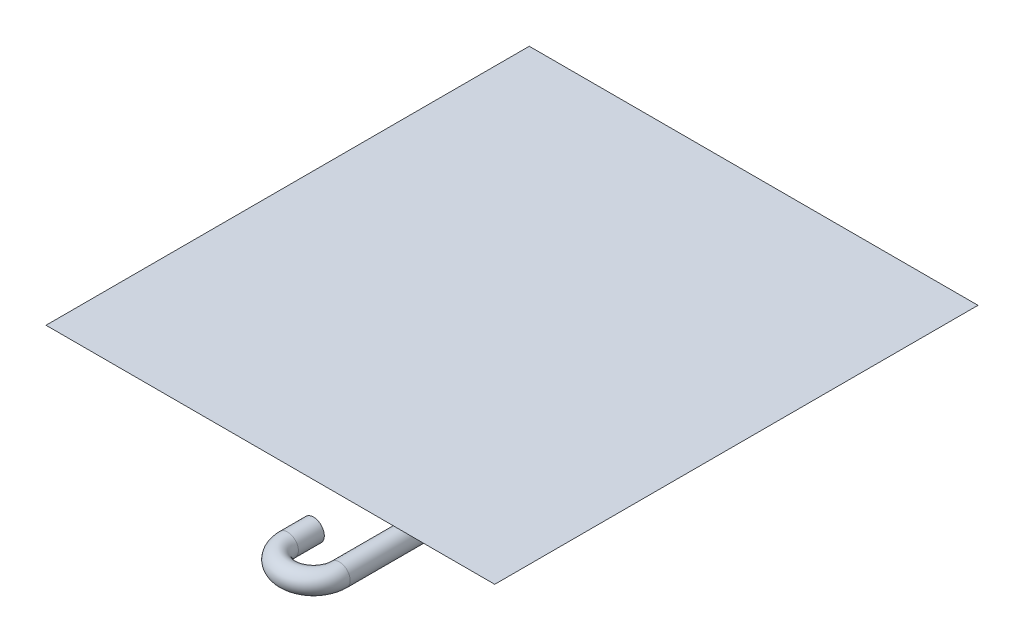
ISO-10303-21;
HEADER;
FILE_DESCRIPTION(('STEP AP214'),'2;1');
FILE_NAME('part.step','',(''),(''),'','','');
FILE_SCHEMA(('AUTOMOTIVE_DESIGN { 1 0 10303 214 1 1 1 1 }'));
ENDSEC;
DATA;
#1=APPLICATION_CONTEXT('core data for automotive mechanical design processes');
#2=APPLICATION_PROTOCOL_DEFINITION('international standard','automotive_design',2000,#1);
#3=PRODUCT_CONTEXT('',#1,'mechanical');
#4=PRODUCT('Part','Part','',(#3));
#5=PRODUCT_RELATED_PRODUCT_CATEGORY('part','',(#4));
#6=PRODUCT_DEFINITION_FORMATION('','',#4);
#7=PRODUCT_DEFINITION_CONTEXT('part definition',#1,'design');
#8=PRODUCT_DEFINITION('design','',#6,#7);
#9=PRODUCT_DEFINITION_SHAPE('','',#8);
#10=(LENGTH_UNIT() NAMED_UNIT(*) SI_UNIT(.MILLI.,.METRE.));
#11=(NAMED_UNIT(*) PLANE_ANGLE_UNIT() SI_UNIT($,.RADIAN.));
#12=(NAMED_UNIT(*) SI_UNIT($,.STERADIAN.) SOLID_ANGLE_UNIT());
#13=UNCERTAINTY_MEASURE_WITH_UNIT(LENGTH_MEASURE(1.E-05),#10,'distance_accuracy_value','');
#14=(GEOMETRIC_REPRESENTATION_CONTEXT(3) GLOBAL_UNCERTAINTY_ASSIGNED_CONTEXT((#13)) GLOBAL_UNIT_ASSIGNED_CONTEXT((#10,
#11,#12)) REPRESENTATION_CONTEXT('',''));
#15=CARTESIAN_POINT('',(0.,0.,0.));
#16=DIRECTION('',(0.,0.,1.));
#17=DIRECTION('',(1.,0.,0.));
#18=AXIS2_PLACEMENT_3D('',#15,#16,#17);
#19=CARTESIAN_POINT('',(0.,-50.8,63.5));
#20=DIRECTION('',(0.,0.,-1.));
#21=DIRECTION('',(-1.,0.,0.));
#22=AXIS2_PLACEMENT_3D('',#19,#20,#21);
#23=CYLINDRICAL_SURFACE('',#22,3.96875);
#24=CARTESIAN_POINT('',(0.,-50.8,63.5));
#25=DIRECTION('',(0.,0.,1.));
#26=DIRECTION('',(1.,0.,0.));
#27=AXIS2_PLACEMENT_3D('',#24,#25,#26);
#28=CIRCLE('',#27,3.96875);
#29=CARTESIAN_POINT('',(3.96875,-50.8,63.5));
#30=VERTEX_POINT('',#29);
#31=EDGE_CURVE('E11',#30,#30,#28,.T.);
#32=ORIENTED_EDGE('',*,*,#31,.F.);
#33=EDGE_LOOP('',(#32));
#34=FACE_BOUND('',#33,.T.);
#35=CARTESIAN_POINT('',(0.,-50.8,-63.5));
#36=DIRECTION('',(0.,0.,1.));
#37=DIRECTION('',(1.,0.,0.));
#38=AXIS2_PLACEMENT_3D('',#35,#36,#37);
#39=CIRCLE('',#38,3.96875);
#40=CARTESIAN_POINT('',(3.96875,-50.8,-63.5));
#41=VERTEX_POINT('',#40);
#42=EDGE_CURVE('E51',#41,#41,#39,.T.);
#43=ORIENTED_EDGE('',*,*,#42,.T.);
#44=EDGE_LOOP('',(#43));
#45=FACE_BOUND('',#44,.T.);
#46=ADVANCED_FACE('F45',(#34,#45),#23,.T.);
#47=CARTESIAN_POINT('',(0.,-50.8,-63.5));
#48=DIRECTION('',(0.,0.,1.));
#49=DIRECTION('',(1.,0.,0.));
#50=AXIS2_PLACEMENT_3D('',#47,#48,#49);
#51=PLANE('',#50);
#52=ORIENTED_EDGE('',*,*,#42,.F.);
#53=EDGE_LOOP('',(#52));
#54=FACE_BOUND('',#53,.T.);
#55=ADVANCED_FACE('F78',(#54),#51,.F.);
#56=CARTESIAN_POINT('',(-19.05,-50.8,63.5));
#57=DIRECTION('',(0.,0.,-1.));
#58=DIRECTION('',(-1.,0.,0.));
#59=AXIS2_PLACEMENT_3D('',#56,#57,#58);
#60=CYLINDRICAL_SURFACE('',#59,3.96875);
#61=CARTESIAN_POINT('',(-19.05,-50.8,63.5));
#62=DIRECTION('',(0.,0.,-1.));
#63=DIRECTION('',(-1.,0.,0.));
#64=AXIS2_PLACEMENT_3D('',#61,#62,#63);
#65=CIRCLE('',#64,3.96875);
#66=CARTESIAN_POINT('',(-23.01875,-50.8,63.5));
#67=VERTEX_POINT('',#66);
#68=EDGE_CURVE('E59',#67,#67,#65,.T.);
#69=ORIENTED_EDGE('',*,*,#68,.T.);
#70=EDGE_LOOP('',(#69));
#71=FACE_BOUND('',#70,.T.);
#72=CARTESIAN_POINT('',(-19.05,-50.8,53.975));
#73=DIRECTION('',(0.,0.,-1.));
#74=DIRECTION('',(-1.,0.,0.));
#75=AXIS2_PLACEMENT_3D('',#72,#73,#74);
#76=CIRCLE('',#75,3.96875);
#77=CARTESIAN_POINT('',(-23.01875,-50.8,53.975));
#78=VERTEX_POINT('',#77);
#79=EDGE_CURVE('E55',#78,#78,#76,.T.);
#80=ORIENTED_EDGE('',*,*,#79,.F.);
#81=EDGE_LOOP('',(#80));
#82=FACE_BOUND('',#81,.T.);
#83=ADVANCED_FACE('F65',(#71,#82),#60,.T.);
#84=CARTESIAN_POINT('',(-9.525,-50.8,63.5));
#85=DIRECTION('',(0.,1.,0.));
#86=DIRECTION('',(0.,0.,1.));
#87=AXIS2_PLACEMENT_3D('',#84,#85,#86);
#88=TOROIDAL_SURFACE('',#87,9.525,3.96875);
#89=CARTESIAN_POINT('',(-9.525,-50.8,63.5));
#90=DIRECTION('',(0.,1.,0.));
#91=DIRECTION('',(0.,0.,1.));
#92=AXIS2_PLACEMENT_3D('',#89,#90,#91);
#93=CIRCLE('',#92,13.49375);
#94=EDGE_CURVE('',#67,#30,#93,.T.);
#95=ORIENTED_EDGE('',*,*,#68,.F.);
#96=ORIENTED_EDGE('',*,*,#31,.T.);
#97=ORIENTED_EDGE('',*,*,#94,.T.);
#98=ORIENTED_EDGE('',*,*,#94,.F.);
#99=EDGE_LOOP('',(#95,#97,#96,#98));
#100=FACE_BOUND('',#99,.T.);
#101=ADVANCED_FACE('F68',(#100),#88,.T.);
#102=CARTESIAN_POINT('',(-19.05,-50.8,53.975));
#103=DIRECTION('',(0.,0.,-1.));
#104=DIRECTION('',(-1.,0.,0.));
#105=AXIS2_PLACEMENT_3D('',#102,#103,#104);
#106=PLANE('',#105);
#107=ORIENTED_EDGE('',*,*,#79,.T.);
#108=EDGE_LOOP('',(#107));
#109=FACE_BOUND('',#108,.T.);
#110=ADVANCED_FACE('F70',(#109),#106,.T.);
#111=CLOSED_SHELL('',(#46,#55,#83,#101,#110));
#112=MANIFOLD_SOLID_BREP('B2',#111);
#113=CARTESIAN_POINT('',(-82.55,0.,-88.9));
#114=DIRECTION('',(0.,-1.,0.));
#115=DIRECTION('',(0.,0.,-1.));
#116=AXIS2_PLACEMENT_3D('',#113,#114,#115);
#117=PLANE('',#116);
#118=DIRECTION('',(1.,0.,0.));
#119=VECTOR('',#118,1.);
#120=CARTESIAN_POINT('',(-82.55,0.,88.9));
#121=LINE('',#120,#119);
#122=CARTESIAN_POINT('',(-82.55,0.,88.9));
#123=VERTEX_POINT('',#122);
#124=CARTESIAN_POINT('',(82.55,0.,88.9));
#125=VERTEX_POINT('',#124);
#126=EDGE_CURVE('E134',#123,#125,#121,.T.);
#127=ORIENTED_EDGE('',*,*,#126,.F.);
#128=DIRECTION('',(0.,0.,1.));
#129=VECTOR('',#128,1.);
#130=CARTESIAN_POINT('',(-82.55,0.,-88.9));
#131=LINE('',#130,#129);
#132=CARTESIAN_POINT('',(-82.55,0.,-88.9));
#133=VERTEX_POINT('',#132);
#134=EDGE_CURVE('E116',#133,#123,#131,.T.);
#135=ORIENTED_EDGE('',*,*,#134,.F.);
#136=DIRECTION('',(1.,0.,0.));
#137=VECTOR('',#136,1.);
#138=CARTESIAN_POINT('',(-82.55,0.,-88.9));
#139=LINE('',#138,#137);
#140=CARTESIAN_POINT('',(82.55,0.,-88.9));
#141=VERTEX_POINT('',#140);
#142=EDGE_CURVE('E122',#133,#141,#139,.T.);
#143=ORIENTED_EDGE('',*,*,#142,.T.);
#144=DIRECTION('',(0.,0.,1.));
#145=VECTOR('',#144,1.);
#146=CARTESIAN_POINT('',(82.55,0.,-88.9));
#147=LINE('',#146,#145);
#148=EDGE_CURVE('E43',#141,#125,#147,.T.);
#149=ORIENTED_EDGE('',*,*,#148,.T.);
#150=EDGE_LOOP('',(#127,#135,#143,#149));
#151=FACE_BOUND('',#150,.T.);
#152=ADVANCED_FACE('F115',(#151),#117,.T.);
#153=OPEN_SHELL('',(#152));
#154=SHELL_BASED_SURFACE_MODEL('B6',(#153));
#155=ADVANCED_BREP_SHAPE_REPRESENTATION('',(#18,#112),#14);
#156=MANIFOLD_SURFACE_SHAPE_REPRESENTATION('',(#18,#154),#14);
#157=SHAPE_REPRESENTATION('',(#18),#14);
#158=SHAPE_DEFINITION_REPRESENTATION(#9,#157);
#159=SHAPE_REPRESENTATION_RELATIONSHIP('','',#157,#155);
#160=SHAPE_REPRESENTATION_RELATIONSHIP('','',#157,#156);
ENDSEC;
END-ISO-10303-21;
